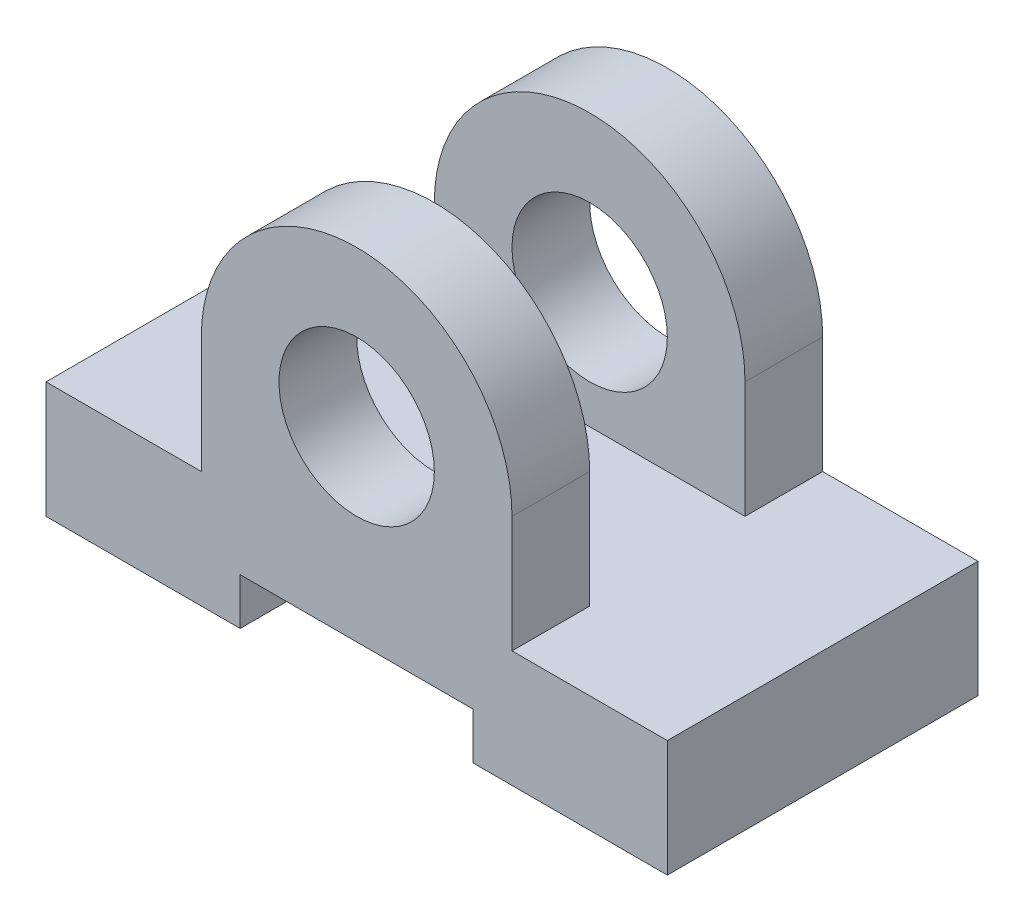
ISO-10303-21;
HEADER;
FILE_DESCRIPTION(('STEP AP214'),'2;1');
FILE_NAME('part.step','',(''),(''),'','','');
FILE_SCHEMA(('AUTOMOTIVE_DESIGN { 1 0 10303 214 1 1 1 1 }'));
ENDSEC;
DATA;
#1=APPLICATION_CONTEXT('core data for automotive mechanical design processes');
#2=APPLICATION_PROTOCOL_DEFINITION('international standard','automotive_design',2000,#1);
#3=PRODUCT_CONTEXT('',#1,'mechanical');
#4=PRODUCT('Part','Part','',(#3));
#5=PRODUCT_RELATED_PRODUCT_CATEGORY('part','',(#4));
#6=PRODUCT_DEFINITION_FORMATION('','',#4);
#7=PRODUCT_DEFINITION_CONTEXT('part definition',#1,'design');
#8=PRODUCT_DEFINITION('design','',#6,#7);
#9=PRODUCT_DEFINITION_SHAPE('','',#8);
#10=(LENGTH_UNIT() NAMED_UNIT(*) SI_UNIT(.MILLI.,.METRE.));
#11=(NAMED_UNIT(*) PLANE_ANGLE_UNIT() SI_UNIT($,.RADIAN.));
#12=(NAMED_UNIT(*) SI_UNIT($,.STERADIAN.) SOLID_ANGLE_UNIT());
#13=UNCERTAINTY_MEASURE_WITH_UNIT(LENGTH_MEASURE(1.E-05),#10,'distance_accuracy_value','');
#14=(GEOMETRIC_REPRESENTATION_CONTEXT(3) GLOBAL_UNCERTAINTY_ASSIGNED_CONTEXT((#13)) GLOBAL_UNIT_ASSIGNED_CONTEXT((#10,
#11,#12)) REPRESENTATION_CONTEXT('',''));
#15=CARTESIAN_POINT('',(0.,0.,0.));
#16=DIRECTION('',(0.,0.,1.));
#17=DIRECTION('',(1.,0.,0.));
#18=AXIS2_PLACEMENT_3D('',#15,#16,#17);
#19=CARTESIAN_POINT('',(-20.,-15.,-40.));
#20=DIRECTION('',(-1.,0.,0.));
#21=DIRECTION('',(0.,0.,1.));
#22=AXIS2_PLACEMENT_3D('',#19,#20,#21);
#23=PLANE('',#22);
#24=DIRECTION('',(0.,-1.,0.));
#25=VECTOR('',#24,1.);
#26=CARTESIAN_POINT('',(-20.,-15.,-30.));
#27=LINE('',#26,#25);
#28=CARTESIAN_POINT('',(-20.,0.,-30.));
#29=VERTEX_POINT('',#28);
#30=CARTESIAN_POINT('',(-20.,-15.,-30.));
#31=VERTEX_POINT('',#30);
#32=EDGE_CURVE('E293',#29,#31,#27,.T.);
#33=ORIENTED_EDGE('',*,*,#32,.F.);
#34=DIRECTION('',(0.,0.,1.));
#35=VECTOR('',#34,1.);
#36=CARTESIAN_POINT('',(-20.,0.,-40.));
#37=LINE('',#36,#35);
#38=CARTESIAN_POINT('',(-20.,0.,-40.));
#39=VERTEX_POINT('',#38);
#40=EDGE_CURVE('E170',#39,#29,#37,.T.);
#41=ORIENTED_EDGE('',*,*,#40,.F.);
#42=DIRECTION('',(0.,-1.,0.));
#43=VECTOR('',#42,1.);
#44=CARTESIAN_POINT('',(-20.,-15.,-40.));
#45=LINE('',#44,#43);
#46=CARTESIAN_POINT('',(-20.,-15.,-40.));
#47=VERTEX_POINT('',#46);
#48=EDGE_CURVE('E164',#39,#47,#45,.T.);
#49=ORIENTED_EDGE('',*,*,#48,.T.);
#50=DIRECTION('',(0.,0.,1.));
#51=VECTOR('',#50,1.);
#52=CARTESIAN_POINT('',(-20.,-15.,-40.));
#53=LINE('',#52,#51);
#54=EDGE_CURVE('E145',#47,#31,#53,.T.);
#55=ORIENTED_EDGE('',*,*,#54,.T.);
#56=EDGE_LOOP('',(#33,#41,#49,#55));
#57=FACE_BOUND('',#56,.T.);
#58=ADVANCED_FACE('F39',(#57),#23,.T.);
#59=CARTESIAN_POINT('',(0.,0.,-40.));
#60=DIRECTION('',(0.,0.,1.));
#61=DIRECTION('',(1.,0.,0.));
#62=AXIS2_PLACEMENT_3D('',#59,#60,#61);
#63=CYLINDRICAL_SURFACE('',#62,20.);
#64=CARTESIAN_POINT('',(0.,0.,-30.));
#65=DIRECTION('',(0.,0.,-1.));
#66=DIRECTION('',(-1.,0.,0.));
#67=AXIS2_PLACEMENT_3D('',#64,#65,#66);
#68=CIRCLE('',#67,20.);
#69=CARTESIAN_POINT('',(20.,0.,-30.));
#70=VERTEX_POINT('',#69);
#71=EDGE_CURVE('E289',#70,#29,#68,.F.);
#72=ORIENTED_EDGE('',*,*,#71,.F.);
#73=DIRECTION('',(0.,0.,1.));
#74=VECTOR('',#73,1.);
#75=CARTESIAN_POINT('',(20.,0.,-40.));
#76=LINE('',#75,#74);
#77=CARTESIAN_POINT('',(20.,0.,-40.));
#78=VERTEX_POINT('',#77);
#79=EDGE_CURVE('E236',#78,#70,#76,.T.);
#80=ORIENTED_EDGE('',*,*,#79,.F.);
#81=CARTESIAN_POINT('',(0.,0.,-40.));
#82=DIRECTION('',(0.,0.,1.));
#83=DIRECTION('',(-1.,0.,0.));
#84=AXIS2_PLACEMENT_3D('',#81,#82,#83);
#85=CIRCLE('',#84,20.);
#86=EDGE_CURVE('E172',#78,#39,#85,.T.);
#87=ORIENTED_EDGE('',*,*,#86,.T.);
#88=ORIENTED_EDGE('',*,*,#40,.T.);
#89=EDGE_LOOP('',(#72,#80,#87,#88));
#90=FACE_BOUND('',#89,.T.);
#91=ADVANCED_FACE('F391',(#90),#63,.T.);
#92=CARTESIAN_POINT('',(20.,-15.,-40.));
#93=DIRECTION('',(1.,0.,0.));
#94=DIRECTION('',(0.,1.,0.));
#95=AXIS2_PLACEMENT_3D('',#92,#93,#94);
#96=PLANE('',#95);
#97=DIRECTION('',(0.,1.,0.));
#98=VECTOR('',#97,1.);
#99=CARTESIAN_POINT('',(20.,-15.,-30.));
#100=LINE('',#99,#98);
#101=CARTESIAN_POINT('',(20.,-15.,-30.));
#102=VERTEX_POINT('',#101);
#103=EDGE_CURVE('E285',#102,#70,#100,.T.);
#104=ORIENTED_EDGE('',*,*,#103,.F.);
#105=DIRECTION('',(0.,0.,1.));
#106=VECTOR('',#105,1.);
#107=CARTESIAN_POINT('',(20.,-15.,-40.));
#108=LINE('',#107,#106);
#109=CARTESIAN_POINT('',(20.,-15.,-40.));
#110=VERTEX_POINT('',#109);
#111=EDGE_CURVE('E241',#110,#102,#108,.T.);
#112=ORIENTED_EDGE('',*,*,#111,.F.);
#113=DIRECTION('',(0.,1.,0.));
#114=VECTOR('',#113,1.);
#115=CARTESIAN_POINT('',(20.,-15.,-40.));
#116=LINE('',#115,#114);
#117=EDGE_CURVE('E175',#110,#78,#116,.T.);
#118=ORIENTED_EDGE('',*,*,#117,.T.);
#119=ORIENTED_EDGE('',*,*,#79,.T.);
#120=EDGE_LOOP('',(#104,#112,#118,#119));
#121=FACE_BOUND('',#120,.T.);
#122=ADVANCED_FACE('F333',(#121),#96,.T.);
#123=CARTESIAN_POINT('',(0.,0.,-40.));
#124=DIRECTION('',(0.,0.,1.));
#125=DIRECTION('',(1.,0.,0.));
#126=AXIS2_PLACEMENT_3D('',#123,#124,#125);
#127=CYLINDRICAL_SURFACE('',#126,9.99999999999999);
#128=CARTESIAN_POINT('',(0.,0.,-30.));
#129=DIRECTION('',(0.,0.,-1.));
#130=DIRECTION('',(-1.,0.,0.));
#131=AXIS2_PLACEMENT_3D('',#128,#129,#130);
#132=CIRCLE('',#131,9.99999999999999);
#133=CARTESIAN_POINT('',(-9.99999999999999,0.,-30.));
#134=VERTEX_POINT('',#133);
#135=EDGE_CURVE('E43',#134,#134,#132,.F.);
#136=ORIENTED_EDGE('',*,*,#135,.T.);
#137=EDGE_LOOP('',(#136));
#138=FACE_BOUND('',#137,.T.);
#139=CARTESIAN_POINT('',(0.,0.,-40.));
#140=DIRECTION('',(0.,0.,1.));
#141=DIRECTION('',(1.,0.,0.));
#142=AXIS2_PLACEMENT_3D('',#139,#140,#141);
#143=CIRCLE('',#142,9.99999999999999);
#144=CARTESIAN_POINT('',(9.99999999999999,0.,-40.));
#145=VERTEX_POINT('',#144);
#146=EDGE_CURVE('E186',#145,#145,#143,.T.);
#147=ORIENTED_EDGE('',*,*,#146,.F.);
#148=EDGE_LOOP('',(#147));
#149=FACE_BOUND('',#148,.T.);
#150=ADVANCED_FACE('F398',(#138,#149),#127,.F.);
#151=CARTESIAN_POINT('',(-40.,-30.,-40.));
#152=DIRECTION('',(0.,-1.,0.));
#153=DIRECTION('',(0.,0.,-1.));
#154=AXIS2_PLACEMENT_3D('',#151,#152,#153);
#155=PLANE('',#154);
#156=DIRECTION('',(1.,0.,0.));
#157=VECTOR('',#156,1.);
#158=CARTESIAN_POINT('',(-40.,-30.,0.));
#159=LINE('',#158,#157);
#160=CARTESIAN_POINT('',(-40.,-30.,0.));
#161=VERTEX_POINT('',#160);
#162=CARTESIAN_POINT('',(-15.,-30.,0.));
#163=VERTEX_POINT('',#162);
#164=EDGE_CURVE('E181',#161,#163,#159,.T.);
#165=ORIENTED_EDGE('',*,*,#164,.F.);
#166=DIRECTION('',(0.,0.,1.));
#167=VECTOR('',#166,1.);
#168=CARTESIAN_POINT('',(-40.,-30.,-40.));
#169=LINE('',#168,#167);
#170=CARTESIAN_POINT('',(-40.,-30.,-40.));
#171=VERTEX_POINT('',#170);
#172=EDGE_CURVE('E11',#171,#161,#169,.T.);
#173=ORIENTED_EDGE('',*,*,#172,.F.);
#174=DIRECTION('',(1.,0.,0.));
#175=VECTOR('',#174,1.);
#176=CARTESIAN_POINT('',(-40.,-30.,-40.));
#177=LINE('',#176,#175);
#178=CARTESIAN_POINT('',(-15.,-30.,-40.));
#179=VERTEX_POINT('',#178);
#180=EDGE_CURVE('E229',#171,#179,#177,.T.);
#181=ORIENTED_EDGE('',*,*,#180,.T.);
#182=DIRECTION('',(0.,0.,1.));
#183=VECTOR('',#182,1.);
#184=CARTESIAN_POINT('',(-15.,-30.,-40.));
#185=LINE('',#184,#183);
#186=EDGE_CURVE('E114',#179,#163,#185,.T.);
#187=ORIENTED_EDGE('',*,*,#186,.T.);
#188=EDGE_LOOP('',(#165,#173,#181,#187));
#189=FACE_BOUND('',#188,.T.);
#190=ADVANCED_FACE('F41',(#189),#155,.T.);
#191=CARTESIAN_POINT('',(-40.,-30.,-40.));
#192=DIRECTION('',(-1.,0.,0.));
#193=DIRECTION('',(0.,-1.,0.));
#194=AXIS2_PLACEMENT_3D('',#191,#192,#193);
#195=PLANE('',#194);
#196=DIRECTION('',(0.,-1.,0.));
#197=VECTOR('',#196,1.);
#198=CARTESIAN_POINT('',(-40.,-30.,0.));
#199=LINE('',#198,#197);
#200=CARTESIAN_POINT('',(-40.,-15.,0.));
#201=VERTEX_POINT('',#200);
#202=EDGE_CURVE('E226',#201,#161,#199,.T.);
#203=ORIENTED_EDGE('',*,*,#202,.F.);
#204=DIRECTION('',(0.,0.,1.));
#205=VECTOR('',#204,1.);
#206=CARTESIAN_POINT('',(-40.,-15.,-40.));
#207=LINE('',#206,#205);
#208=CARTESIAN_POINT('',(-40.,-15.,-40.));
#209=VERTEX_POINT('',#208);
#210=EDGE_CURVE('E49',#209,#201,#207,.T.);
#211=ORIENTED_EDGE('',*,*,#210,.F.);
#212=DIRECTION('',(0.,-1.,0.));
#213=VECTOR('',#212,1.);
#214=CARTESIAN_POINT('',(-40.,-30.,-40.));
#215=LINE('',#214,#213);
#216=EDGE_CURVE('E166',#209,#171,#215,.T.);
#217=ORIENTED_EDGE('',*,*,#216,.T.);
#218=ORIENTED_EDGE('',*,*,#172,.T.);
#219=EDGE_LOOP('',(#203,#211,#217,#218));
#220=FACE_BOUND('',#219,.T.);
#221=ADVANCED_FACE('F358',(#220),#195,.T.);
#222=CARTESIAN_POINT('',(-40.,-15.,-40.));
#223=DIRECTION('',(0.,1.,0.));
#224=DIRECTION('',(0.,0.,1.));
#225=AXIS2_PLACEMENT_3D('',#222,#223,#224);
#226=PLANE('',#225);
#227=CARTESIAN_POINT('',(-20.,-15.,-10.));
#228=VERTEX_POINT('',#227);
#229=CARTESIAN_POINT('',(-20.,-15.,0.));
#230=VERTEX_POINT('',#229);
#231=EDGE_CURVE('E158',#228,#230,#53,.T.);
#232=ORIENTED_EDGE('',*,*,#231,.F.);
#233=DIRECTION('',(-1.,0.,0.));
#234=VECTOR('',#233,1.);
#235=CARTESIAN_POINT('',(40.,-15.,-10.));
#236=LINE('',#235,#234);
#237=CARTESIAN_POINT('',(20.,-15.,-10.));
#238=VERTEX_POINT('',#237);
#239=EDGE_CURVE('E57',#238,#228,#236,.T.);
#240=ORIENTED_EDGE('',*,*,#239,.F.);
#241=CARTESIAN_POINT('',(20.,-15.,0.));
#242=VERTEX_POINT('',#241);
#243=EDGE_CURVE('E244',#238,#242,#108,.T.);
#244=ORIENTED_EDGE('',*,*,#243,.T.);
#245=DIRECTION('',(-1.,0.,0.));
#246=VECTOR('',#245,1.);
#247=CARTESIAN_POINT('',(40.,-15.,0.));
#248=LINE('',#247,#246);
#249=CARTESIAN_POINT('',(40.,-15.,0.));
#250=VERTEX_POINT('',#249);
#251=EDGE_CURVE('E206',#250,#242,#248,.T.);
#252=ORIENTED_EDGE('',*,*,#251,.F.);
#253=DIRECTION('',(0.,0.,1.));
#254=VECTOR('',#253,1.);
#255=CARTESIAN_POINT('',(40.,-15.,-40.));
#256=LINE('',#255,#254);
#257=CARTESIAN_POINT('',(40.,-15.,-40.));
#258=VERTEX_POINT('',#257);
#259=EDGE_CURVE('E245',#258,#250,#256,.T.);
#260=ORIENTED_EDGE('',*,*,#259,.F.);
#261=DIRECTION('',(-1.,0.,0.));
#262=VECTOR('',#261,1.);
#263=CARTESIAN_POINT('',(40.,-15.,-40.));
#264=LINE('',#263,#262);
#265=EDGE_CURVE('E325',#258,#110,#264,.T.);
#266=ORIENTED_EDGE('',*,*,#265,.T.);
#267=ORIENTED_EDGE('',*,*,#111,.T.);
#268=DIRECTION('',(-1.,0.,0.));
#269=VECTOR('',#268,1.);
#270=CARTESIAN_POINT('',(40.,-15.,-30.));
#271=LINE('',#270,#269);
#272=EDGE_CURVE('E153',#102,#31,#271,.T.);
#273=ORIENTED_EDGE('',*,*,#272,.T.);
#274=ORIENTED_EDGE('',*,*,#54,.F.);
#275=DIRECTION('',(-1.,0.,0.));
#276=VECTOR('',#275,1.);
#277=CARTESIAN_POINT('',(-40.,-15.,-40.));
#278=LINE('',#277,#276);
#279=EDGE_CURVE('E148',#47,#209,#278,.T.);
#280=ORIENTED_EDGE('',*,*,#279,.T.);
#281=ORIENTED_EDGE('',*,*,#210,.T.);
#282=DIRECTION('',(-1.,0.,0.));
#283=VECTOR('',#282,1.);
#284=CARTESIAN_POINT('',(-40.,-15.,0.));
#285=LINE('',#284,#283);
#286=EDGE_CURVE('E222',#230,#201,#285,.T.);
#287=ORIENTED_EDGE('',*,*,#286,.F.);
#288=EDGE_LOOP('',(#232,#240,#244,#252,#260,#266,#267,#273,#274,#280,#281,#287));
#289=FACE_BOUND('',#288,.T.);
#290=ADVANCED_FACE('F147',(#289),#226,.T.);
#291=DIRECTION('',(0.,1.,0.));
#292=VECTOR('',#291,1.);
#293=CARTESIAN_POINT('',(-20.,-15.,-10.));
#294=LINE('',#293,#292);
#295=CARTESIAN_POINT('',(-20.,0.,-10.));
#296=VERTEX_POINT('',#295);
#297=EDGE_CURVE('E282',#228,#296,#294,.T.);
#298=ORIENTED_EDGE('',*,*,#297,.F.);
#299=ORIENTED_EDGE('',*,*,#231,.T.);
#300=DIRECTION('',(0.,-1.,0.));
#301=VECTOR('',#300,1.);
#302=CARTESIAN_POINT('',(-20.,-15.,0.));
#303=LINE('',#302,#301);
#304=CARTESIAN_POINT('',(-20.,0.,0.));
#305=VERTEX_POINT('',#304);
#306=EDGE_CURVE('E218',#305,#230,#303,.T.);
#307=ORIENTED_EDGE('',*,*,#306,.F.);
#308=EDGE_CURVE('E235',#296,#305,#37,.T.);
#309=ORIENTED_EDGE('',*,*,#308,.F.);
#310=EDGE_LOOP('',(#298,#299,#307,#309));
#311=FACE_BOUND('',#310,.T.);
#312=ADVANCED_FACE('F363',(#311),#23,.T.);
#313=CARTESIAN_POINT('',(0.,0.,-10.));
#314=DIRECTION('',(0.,0.,1.));
#315=DIRECTION('',(0.,-1.,0.));
#316=AXIS2_PLACEMENT_3D('',#313,#314,#315);
#317=CIRCLE('',#316,20.);
#318=CARTESIAN_POINT('',(20.,0.,-10.));
#319=VERTEX_POINT('',#318);
#320=EDGE_CURVE('E269',#296,#319,#317,.F.);
#321=ORIENTED_EDGE('',*,*,#320,.F.);
#322=ORIENTED_EDGE('',*,*,#308,.T.);
#323=CARTESIAN_POINT('',(0.,0.,0.));
#324=DIRECTION('',(0.,0.,1.));
#325=DIRECTION('',(-1.,0.,0.));
#326=AXIS2_PLACEMENT_3D('',#323,#324,#325);
#327=CIRCLE('',#326,20.);
#328=CARTESIAN_POINT('',(20.,0.,0.));
#329=VERTEX_POINT('',#328);
#330=EDGE_CURVE('E214',#329,#305,#327,.T.);
#331=ORIENTED_EDGE('',*,*,#330,.F.);
#332=EDGE_CURVE('E240',#319,#329,#76,.T.);
#333=ORIENTED_EDGE('',*,*,#332,.F.);
#334=EDGE_LOOP('',(#321,#322,#331,#333));
#335=FACE_BOUND('',#334,.T.);
#336=ADVANCED_FACE('F378',(#335),#63,.T.);
#337=DIRECTION('',(0.,-1.,0.));
#338=VECTOR('',#337,1.);
#339=CARTESIAN_POINT('',(20.,-15.,-10.));
#340=LINE('',#339,#338);
#341=EDGE_CURVE('E264',#319,#238,#340,.T.);
#342=ORIENTED_EDGE('',*,*,#341,.F.);
#343=ORIENTED_EDGE('',*,*,#332,.T.);
#344=DIRECTION('',(0.,1.,0.));
#345=VECTOR('',#344,1.);
#346=CARTESIAN_POINT('',(20.,-15.,0.));
#347=LINE('',#346,#345);
#348=EDGE_CURVE('E210',#242,#329,#347,.T.);
#349=ORIENTED_EDGE('',*,*,#348,.F.);
#350=ORIENTED_EDGE('',*,*,#243,.F.);
#351=EDGE_LOOP('',(#342,#343,#349,#350));
#352=FACE_BOUND('',#351,.T.);
#353=ADVANCED_FACE('F373',(#352),#96,.T.);
#354=CARTESIAN_POINT('',(40.,-30.,-40.));
#355=DIRECTION('',(1.,0.,0.));
#356=DIRECTION('',(0.,0.,-1.));
#357=AXIS2_PLACEMENT_3D('',#354,#355,#356);
#358=PLANE('',#357);
#359=DIRECTION('',(0.,1.,0.));
#360=VECTOR('',#359,1.);
#361=CARTESIAN_POINT('',(40.,-30.,0.));
#362=LINE('',#361,#360);
#363=CARTESIAN_POINT('',(40.,-30.,0.));
#364=VERTEX_POINT('',#363);
#365=EDGE_CURVE('E202',#364,#250,#362,.T.);
#366=ORIENTED_EDGE('',*,*,#365,.F.);
#367=DIRECTION('',(0.,0.,1.));
#368=VECTOR('',#367,1.);
#369=CARTESIAN_POINT('',(40.,-30.,-40.));
#370=LINE('',#369,#368);
#371=CARTESIAN_POINT('',(40.,-30.,-40.));
#372=VERTEX_POINT('',#371);
#373=EDGE_CURVE('E248',#372,#364,#370,.T.);
#374=ORIENTED_EDGE('',*,*,#373,.F.);
#375=DIRECTION('',(0.,1.,0.));
#376=VECTOR('',#375,1.);
#377=CARTESIAN_POINT('',(40.,-30.,-40.));
#378=LINE('',#377,#376);
#379=EDGE_CURVE('E321',#372,#258,#378,.T.);
#380=ORIENTED_EDGE('',*,*,#379,.T.);
#381=ORIENTED_EDGE('',*,*,#259,.T.);
#382=EDGE_LOOP('',(#366,#374,#380,#381));
#383=FACE_BOUND('',#382,.T.);
#384=ADVANCED_FACE('F341',(#383),#358,.T.);
#385=CARTESIAN_POINT('',(15.,-30.,-40.));
#386=DIRECTION('',(0.,-1.,0.));
#387=DIRECTION('',(1.,0.,0.));
#388=AXIS2_PLACEMENT_3D('',#385,#386,#387);
#389=PLANE('',#388);
#390=DIRECTION('',(1.,0.,0.));
#391=VECTOR('',#390,1.);
#392=CARTESIAN_POINT('',(15.,-30.,0.));
#393=LINE('',#392,#391);
#394=CARTESIAN_POINT('',(15.,-30.,0.));
#395=VERTEX_POINT('',#394);
#396=EDGE_CURVE('E198',#395,#364,#393,.T.);
#397=ORIENTED_EDGE('',*,*,#396,.F.);
#398=DIRECTION('',(0.,0.,1.));
#399=VECTOR('',#398,1.);
#400=CARTESIAN_POINT('',(15.,-30.,-40.));
#401=LINE('',#400,#399);
#402=CARTESIAN_POINT('',(15.,-30.,-40.));
#403=VERTEX_POINT('',#402);
#404=EDGE_CURVE('E251',#403,#395,#401,.T.);
#405=ORIENTED_EDGE('',*,*,#404,.F.);
#406=DIRECTION('',(1.,0.,0.));
#407=VECTOR('',#406,1.);
#408=CARTESIAN_POINT('',(15.,-30.,-40.));
#409=LINE('',#408,#407);
#410=EDGE_CURVE('E317',#403,#372,#409,.T.);
#411=ORIENTED_EDGE('',*,*,#410,.T.);
#412=ORIENTED_EDGE('',*,*,#373,.T.);
#413=EDGE_LOOP('',(#397,#405,#411,#412));
#414=FACE_BOUND('',#413,.T.);
#415=ADVANCED_FACE('F346',(#414),#389,.T.);
#416=CARTESIAN_POINT('',(15.,-30.,-40.));
#417=DIRECTION('',(-1.,0.,0.));
#418=DIRECTION('',(0.,-1.,0.));
#419=AXIS2_PLACEMENT_3D('',#416,#417,#418);
#420=PLANE('',#419);
#421=DIRECTION('',(0.,-1.,0.));
#422=VECTOR('',#421,1.);
#423=CARTESIAN_POINT('',(15.,-30.,0.));
#424=LINE('',#423,#422);
#425=CARTESIAN_POINT('',(15.,-24.,0.));
#426=VERTEX_POINT('',#425);
#427=EDGE_CURVE('E194',#426,#395,#424,.T.);
#428=ORIENTED_EDGE('',*,*,#427,.F.);
#429=DIRECTION('',(0.,0.,1.));
#430=VECTOR('',#429,1.);
#431=CARTESIAN_POINT('',(15.,-24.,-40.));
#432=LINE('',#431,#430);
#433=CARTESIAN_POINT('',(15.,-24.,-40.));
#434=VERTEX_POINT('',#433);
#435=EDGE_CURVE('E254',#434,#426,#432,.T.);
#436=ORIENTED_EDGE('',*,*,#435,.F.);
#437=DIRECTION('',(0.,-1.,0.));
#438=VECTOR('',#437,1.);
#439=CARTESIAN_POINT('',(15.,-30.,-40.));
#440=LINE('',#439,#438);
#441=EDGE_CURVE('E313',#434,#403,#440,.T.);
#442=ORIENTED_EDGE('',*,*,#441,.T.);
#443=ORIENTED_EDGE('',*,*,#404,.T.);
#444=EDGE_LOOP('',(#428,#436,#442,#443));
#445=FACE_BOUND('',#444,.T.);
#446=ADVANCED_FACE('F349',(#445),#420,.T.);
#447=CARTESIAN_POINT('',(15.,-24.,-40.));
#448=DIRECTION('',(0.,-1.,0.));
#449=DIRECTION('',(1.,0.,0.));
#450=AXIS2_PLACEMENT_3D('',#447,#448,#449);
#451=PLANE('',#450);
#452=DIRECTION('',(1.,0.,0.));
#453=VECTOR('',#452,1.);
#454=CARTESIAN_POINT('',(15.,-24.,0.));
#455=LINE('',#454,#453);
#456=CARTESIAN_POINT('',(-15.,-24.,0.));
#457=VERTEX_POINT('',#456);
#458=EDGE_CURVE('E190',#457,#426,#455,.T.);
#459=ORIENTED_EDGE('',*,*,#458,.F.);
#460=DIRECTION('',(0.,0.,1.));
#461=VECTOR('',#460,1.);
#462=CARTESIAN_POINT('',(-15.,-24.,-40.));
#463=LINE('',#462,#461);
#464=CARTESIAN_POINT('',(-15.,-24.,-40.));
#465=VERTEX_POINT('',#464);
#466=EDGE_CURVE('E257',#465,#457,#463,.T.);
#467=ORIENTED_EDGE('',*,*,#466,.F.);
#468=DIRECTION('',(1.,0.,0.));
#469=VECTOR('',#468,1.);
#470=CARTESIAN_POINT('',(15.,-24.,-40.));
#471=LINE('',#470,#469);
#472=EDGE_CURVE('E309',#465,#434,#471,.T.);
#473=ORIENTED_EDGE('',*,*,#472,.T.);
#474=ORIENTED_EDGE('',*,*,#435,.T.);
#475=EDGE_LOOP('',(#459,#467,#473,#474));
#476=FACE_BOUND('',#475,.T.);
#477=ADVANCED_FACE('F353',(#476),#451,.T.);
#478=CARTESIAN_POINT('',(-15.,-24.,-40.));
#479=DIRECTION('',(1.,0.,0.));
#480=DIRECTION('',(0.,0.,-1.));
#481=AXIS2_PLACEMENT_3D('',#478,#479,#480);
#482=PLANE('',#481);
#483=DIRECTION('',(0.,1.,0.));
#484=VECTOR('',#483,1.);
#485=CARTESIAN_POINT('',(-15.,-24.,0.));
#486=LINE('',#485,#484);
#487=EDGE_CURVE('E185',#163,#457,#486,.T.);
#488=ORIENTED_EDGE('',*,*,#487,.F.);
#489=ORIENTED_EDGE('',*,*,#186,.F.);
#490=DIRECTION('',(0.,1.,0.));
#491=VECTOR('',#490,1.);
#492=CARTESIAN_POINT('',(-15.,-24.,-40.));
#493=LINE('',#492,#491);
#494=EDGE_CURVE('E306',#179,#465,#493,.T.);
#495=ORIENTED_EDGE('',*,*,#494,.T.);
#496=ORIENTED_EDGE('',*,*,#466,.T.);
#497=EDGE_LOOP('',(#488,#489,#495,#496));
#498=FACE_BOUND('',#497,.T.);
#499=ADVANCED_FACE('F354',(#498),#482,.T.);
#500=CARTESIAN_POINT('',(0.,0.,-40.));
#501=DIRECTION('',(0.,0.,-1.));
#502=DIRECTION('',(-1.,0.,0.));
#503=AXIS2_PLACEMENT_3D('',#500,#501,#502);
#504=PLANE('',#503);
#505=ORIENTED_EDGE('',*,*,#146,.T.);
#506=EDGE_LOOP('',(#505));
#507=FACE_BOUND('',#506,.T.);
#508=ORIENTED_EDGE('',*,*,#180,.F.);
#509=ORIENTED_EDGE('',*,*,#216,.F.);
#510=ORIENTED_EDGE('',*,*,#279,.F.);
#511=ORIENTED_EDGE('',*,*,#48,.F.);
#512=ORIENTED_EDGE('',*,*,#86,.F.);
#513=ORIENTED_EDGE('',*,*,#117,.F.);
#514=ORIENTED_EDGE('',*,*,#265,.F.);
#515=ORIENTED_EDGE('',*,*,#379,.F.);
#516=ORIENTED_EDGE('',*,*,#410,.F.);
#517=ORIENTED_EDGE('',*,*,#441,.F.);
#518=ORIENTED_EDGE('',*,*,#472,.F.);
#519=ORIENTED_EDGE('',*,*,#494,.F.);
#520=EDGE_LOOP('',(#508,#509,#510,#511,#512,#513,#514,#515,#516,#517,#518,#519));
#521=FACE_BOUND('',#520,.T.);
#522=ADVANCED_FACE('F162',(#507,#521),#504,.T.);
#523=CARTESIAN_POINT('',(0.,0.,0.));
#524=DIRECTION('',(0.,0.,-1.));
#525=DIRECTION('',(-1.,0.,0.));
#526=AXIS2_PLACEMENT_3D('',#523,#524,#525);
#527=PLANE('',#526);
#528=CARTESIAN_POINT('',(0.,0.,0.));
#529=DIRECTION('',(0.,0.,1.));
#530=DIRECTION('',(1.,0.,0.));
#531=AXIS2_PLACEMENT_3D('',#528,#529,#530);
#532=CIRCLE('',#531,9.99999999999999);
#533=CARTESIAN_POINT('',(9.99999999999999,0.,0.));
#534=VERTEX_POINT('',#533);
#535=EDGE_CURVE('E297',#534,#534,#532,.T.);
#536=ORIENTED_EDGE('',*,*,#535,.F.);
#537=EDGE_LOOP('',(#536));
#538=FACE_BOUND('',#537,.T.);
#539=ORIENTED_EDGE('',*,*,#164,.T.);
#540=ORIENTED_EDGE('',*,*,#487,.T.);
#541=ORIENTED_EDGE('',*,*,#458,.T.);
#542=ORIENTED_EDGE('',*,*,#427,.T.);
#543=ORIENTED_EDGE('',*,*,#396,.T.);
#544=ORIENTED_EDGE('',*,*,#365,.T.);
#545=ORIENTED_EDGE('',*,*,#251,.T.);
#546=ORIENTED_EDGE('',*,*,#348,.T.);
#547=ORIENTED_EDGE('',*,*,#330,.T.);
#548=ORIENTED_EDGE('',*,*,#306,.T.);
#549=ORIENTED_EDGE('',*,*,#286,.T.);
#550=ORIENTED_EDGE('',*,*,#202,.T.);
#551=EDGE_LOOP('',(#539,#540,#541,#542,#543,#544,#545,#546,#547,#548,#549,#550));
#552=FACE_BOUND('',#551,.T.);
#553=ADVANCED_FACE('F356',(#538,#552),#527,.F.);
#554=CARTESIAN_POINT('',(0.,0.,-10.));
#555=DIRECTION('',(0.,0.,1.));
#556=DIRECTION('',(0.,-1.,0.));
#557=AXIS2_PLACEMENT_3D('',#554,#555,#556);
#558=CIRCLE('',#557,9.99999999999999);
#559=CARTESIAN_POINT('',(0.,-9.99999999999999,-10.));
#560=VERTEX_POINT('',#559);
#561=EDGE_CURVE('E261',#560,#560,#558,.F.);
#562=ORIENTED_EDGE('',*,*,#561,.T.);
#563=EDGE_LOOP('',(#562));
#564=FACE_BOUND('',#563,.T.);
#565=ORIENTED_EDGE('',*,*,#535,.T.);
#566=EDGE_LOOP('',(#565));
#567=FACE_BOUND('',#566,.T.);
#568=ADVANCED_FACE('F415',(#564,#567),#127,.F.);
#569=CARTESIAN_POINT('',(40.,20.,-30.));
#570=DIRECTION('',(0.,0.,-1.));
#571=DIRECTION('',(-1.,0.,0.));
#572=AXIS2_PLACEMENT_3D('',#569,#570,#571);
#573=PLANE('',#572);
#574=ORIENTED_EDGE('',*,*,#32,.T.);
#575=ORIENTED_EDGE('',*,*,#272,.F.);
#576=ORIENTED_EDGE('',*,*,#103,.T.);
#577=ORIENTED_EDGE('',*,*,#71,.T.);
#578=EDGE_LOOP('',(#574,#575,#576,#577));
#579=FACE_BOUND('',#578,.T.);
#580=ORIENTED_EDGE('',*,*,#135,.F.);
#581=EDGE_LOOP('',(#580));
#582=FACE_BOUND('',#581,.T.);
#583=ADVANCED_FACE('F389',(#579,#582),#573,.F.);
#584=CARTESIAN_POINT('',(40.,20.,-10.));
#585=DIRECTION('',(0.,0.,1.));
#586=DIRECTION('',(0.,-1.,0.));
#587=AXIS2_PLACEMENT_3D('',#584,#585,#586);
#588=PLANE('',#587);
#589=ORIENTED_EDGE('',*,*,#297,.T.);
#590=ORIENTED_EDGE('',*,*,#320,.T.);
#591=ORIENTED_EDGE('',*,*,#341,.T.);
#592=ORIENTED_EDGE('',*,*,#239,.T.);
#593=EDGE_LOOP('',(#589,#590,#591,#592));
#594=FACE_BOUND('',#593,.T.);
#595=ORIENTED_EDGE('',*,*,#561,.F.);
#596=EDGE_LOOP('',(#595));
#597=FACE_BOUND('',#596,.T.);
#598=ADVANCED_FACE('F380',(#594,#597),#588,.F.);
#599=CLOSED_SHELL('',(#58,#91,#122,#150,#190,#221,#290,#312,#336,#353,#384,#415,#446,#477,#499,
#522,#553,#568,#583,#598));
#600=MANIFOLD_SOLID_BREP('B2',#599);
#601=ADVANCED_BREP_SHAPE_REPRESENTATION('',(#18,#600),#14);
#602=SHAPE_DEFINITION_REPRESENTATION(#9,#601);
ENDSEC;
END-ISO-10303-21;
